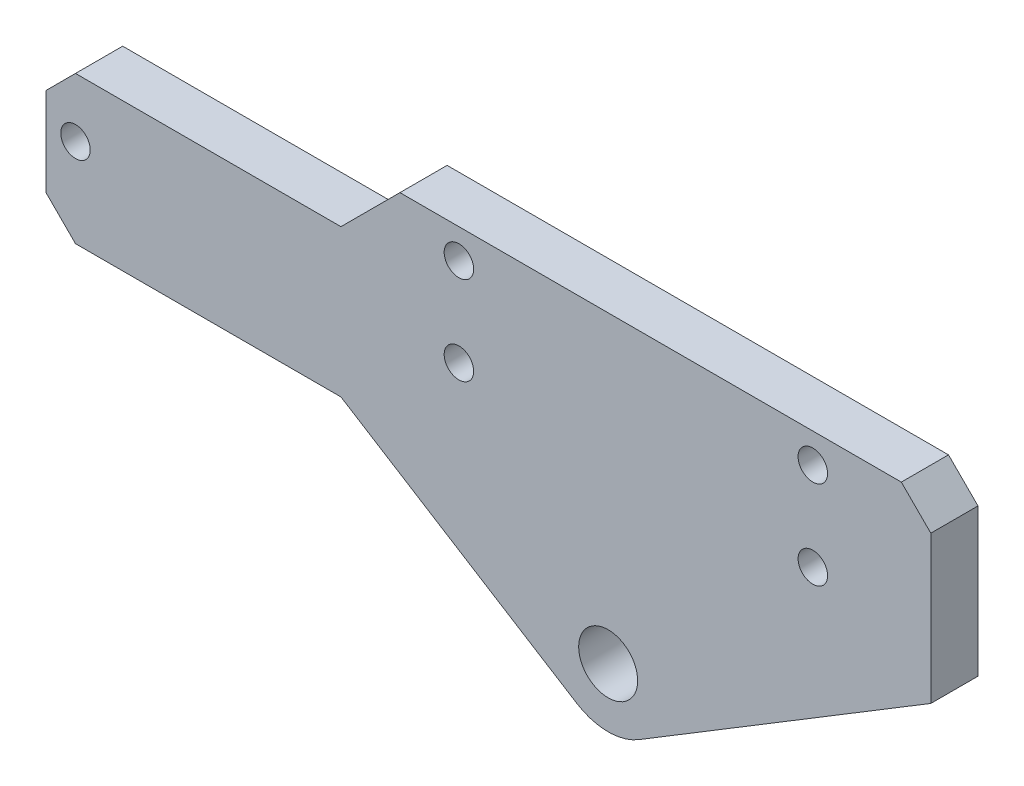
ISO-10303-21;
HEADER;
FILE_DESCRIPTION(('STEP AP214'),'2;1');
FILE_NAME('part.step','',(''),(''),'','','');
FILE_SCHEMA(('AUTOMOTIVE_DESIGN { 1 0 10303 214 1 1 1 1 }'));
ENDSEC;
DATA;
#1=APPLICATION_CONTEXT('core data for automotive mechanical design processes');
#2=APPLICATION_PROTOCOL_DEFINITION('international standard','automotive_design',2000,#1);
#3=PRODUCT_CONTEXT('',#1,'mechanical');
#4=PRODUCT('Part','Part','',(#3));
#5=PRODUCT_RELATED_PRODUCT_CATEGORY('part','',(#4));
#6=PRODUCT_DEFINITION_FORMATION('','',#4);
#7=PRODUCT_DEFINITION_CONTEXT('part definition',#1,'design');
#8=PRODUCT_DEFINITION('design','',#6,#7);
#9=PRODUCT_DEFINITION_SHAPE('','',#8);
#10=(LENGTH_UNIT() NAMED_UNIT(*) SI_UNIT(.MILLI.,.METRE.));
#11=(NAMED_UNIT(*) PLANE_ANGLE_UNIT() SI_UNIT($,.RADIAN.));
#12=(NAMED_UNIT(*) SI_UNIT($,.STERADIAN.) SOLID_ANGLE_UNIT());
#13=UNCERTAINTY_MEASURE_WITH_UNIT(LENGTH_MEASURE(1.E-05),#10,'distance_accuracy_value','');
#14=(GEOMETRIC_REPRESENTATION_CONTEXT(3) GLOBAL_UNCERTAINTY_ASSIGNED_CONTEXT((#13)) GLOBAL_UNIT_ASSIGNED_CONTEXT((#10,
#11,#12)) REPRESENTATION_CONTEXT('',''));
#15=CARTESIAN_POINT('',(0.,0.,0.));
#16=DIRECTION('',(0.,0.,1.));
#17=DIRECTION('',(1.,0.,0.));
#18=AXIS2_PLACEMENT_3D('',#15,#16,#17);
#19=CARTESIAN_POINT('',(20.7761574685095,-27.798118796545,3.5));
#20=DIRECTION('',(0.,0.,-1.));
#21=DIRECTION('',(-1.,0.,0.));
#22=AXIS2_PLACEMENT_3D('',#19,#20,#21);
#23=CYLINDRICAL_SURFACE('',#22,5.00000000000001);
#24=CARTESIAN_POINT('',(20.7761574685095,-27.798118796545,-11.5));
#25=DIRECTION('',(0.,0.,1.));
#26=DIRECTION('',(1.,0.,0.));
#27=AXIS2_PLACEMENT_3D('',#24,#25,#26);
#28=CIRCLE('',#27,5.00000000000001);
#29=CARTESIAN_POINT('',(25.7761574685095,-27.798118796545,-11.5));
#30=VERTEX_POINT('',#29);
#31=EDGE_CURVE('E197',#30,#30,#28,.T.);
#32=ORIENTED_EDGE('',*,*,#31,.F.);
#33=EDGE_LOOP('',(#32));
#34=FACE_BOUND('',#33,.T.);
#35=CARTESIAN_POINT('',(20.7761574685095,-27.798118796545,-3.5));
#36=DIRECTION('',(0.,0.,-1.));
#37=DIRECTION('',(-1.,0.,0.));
#38=AXIS2_PLACEMENT_3D('',#35,#36,#37);
#39=CIRCLE('',#38,5.00000000000001);
#40=CARTESIAN_POINT('',(15.7761574685095,-27.798118796545,-3.5));
#41=VERTEX_POINT('',#40);
#42=EDGE_CURVE('E221',#41,#41,#39,.T.);
#43=ORIENTED_EDGE('',*,*,#42,.F.);
#44=EDGE_LOOP('',(#43));
#45=FACE_BOUND('',#44,.T.);
#46=ADVANCED_FACE('F39',(#34,#45),#23,.F.);
#47=CARTESIAN_POINT('',(20.7761574685095,-27.798118796545,-11.5));
#48=DIRECTION('',(0.,0.,1.));
#49=DIRECTION('',(-1.,0.,0.));
#50=AXIS2_PLACEMENT_3D('',#47,#48,#49);
#51=CYLINDRICAL_SURFACE('',#50,10.);
#52=CARTESIAN_POINT('',(20.7761574685095,-27.798118796545,-3.5));
#53=DIRECTION('',(0.,0.,-1.));
#54=DIRECTION('',(-1.,0.,0.));
#55=AXIS2_PLACEMENT_3D('',#52,#53,#54);
#56=CIRCLE('',#55,10.);
#57=CARTESIAN_POINT('',(25.9669617763287,-36.345372778844,-3.5));
#58=VERTEX_POINT('',#57);
#59=CARTESIAN_POINT('',(15.4761680684777,-36.2781018365958,-3.5));
#60=VERTEX_POINT('',#59);
#61=EDGE_CURVE('E239',#58,#60,#56,.T.);
#62=ORIENTED_EDGE('',*,*,#61,.T.);
#63=DIRECTION('',(0.,0.,1.));
#64=VECTOR('',#63,1.);
#65=CARTESIAN_POINT('',(15.4761680684777,-36.2781018365958,-11.5));
#66=LINE('',#65,#64);
#67=CARTESIAN_POINT('',(15.4761680684777,-36.2781018365958,-11.5));
#68=VERTEX_POINT('',#67);
#69=EDGE_CURVE('E180',#68,#60,#66,.T.);
#70=ORIENTED_EDGE('',*,*,#69,.F.);
#71=CARTESIAN_POINT('',(20.7761574685095,-27.798118796545,-11.5));
#72=DIRECTION('',(0.,0.,1.));
#73=DIRECTION('',(1.,0.,0.));
#74=AXIS2_PLACEMENT_3D('',#71,#72,#73);
#75=CIRCLE('',#74,10.);
#76=CARTESIAN_POINT('',(25.9669617763287,-36.345372778844,-11.5));
#77=VERTEX_POINT('',#76);
#78=EDGE_CURVE('E194',#68,#77,#75,.T.);
#79=ORIENTED_EDGE('',*,*,#78,.T.);
#80=DIRECTION('',(0.,0.,1.));
#81=VECTOR('',#80,1.);
#82=CARTESIAN_POINT('',(25.9669617763287,-36.345372778844,-11.5));
#83=LINE('',#82,#81);
#84=EDGE_CURVE('E171',#77,#58,#83,.T.);
#85=ORIENTED_EDGE('',*,*,#84,.T.);
#86=EDGE_LOOP('',(#62,#70,#79,#85));
#87=FACE_BOUND('',#86,.T.);
#88=ADVANCED_FACE('F276',(#87),#51,.T.);
#89=CARTESIAN_POINT('',(75.4761680684777,-6.27810183659583,-11.5));
#90=DIRECTION('',(-0.519080430781914,0.854725398229901,0.));
#91=DIRECTION('',(-0.854725398229901,-0.519080430781914,0.));
#92=AXIS2_PLACEMENT_3D('',#89,#90,#91);
#93=PLANE('',#92);
#94=DIRECTION('',(-0.854725398229901,-0.519080430781914,0.));
#95=VECTOR('',#94,1.);
#96=CARTESIAN_POINT('',(75.4761680684777,-6.27810183659583,-3.5));
#97=LINE('',#96,#95);
#98=CARTESIAN_POINT('',(75.4761680684777,-6.27810183659583,-3.5));
#99=VERTEX_POINT('',#98);
#100=EDGE_CURVE('E242',#99,#58,#97,.T.);
#101=ORIENTED_EDGE('',*,*,#100,.T.);
#102=ORIENTED_EDGE('',*,*,#84,.F.);
#103=DIRECTION('',(0.854725398229901,0.519080430781914,0.));
#104=VECTOR('',#103,1.);
#105=CARTESIAN_POINT('',(75.4761680684777,-6.27810183659583,-11.5));
#106=LINE('',#105,#104);
#107=CARTESIAN_POINT('',(75.4761680684777,-6.27810183659583,-11.5));
#108=VERTEX_POINT('',#107);
#109=EDGE_CURVE('E191',#77,#108,#106,.T.);
#110=ORIENTED_EDGE('',*,*,#109,.T.);
#111=DIRECTION('',(0.,0.,1.));
#112=VECTOR('',#111,1.);
#113=CARTESIAN_POINT('',(75.4761680684777,-6.27810183659583,-11.5));
#114=LINE('',#113,#112);
#115=EDGE_CURVE('E174',#108,#99,#114,.T.);
#116=ORIENTED_EDGE('',*,*,#115,.T.);
#117=EDGE_LOOP('',(#101,#102,#110,#116));
#118=FACE_BOUND('',#117,.T.);
#119=ADVANCED_FACE('F279',(#118),#93,.F.);
#120=CARTESIAN_POINT('',(75.4761680684777,23.7218981634042,-11.5));
#121=DIRECTION('',(-1.,0.,0.));
#122=DIRECTION('',(0.,0.,-1.));
#123=AXIS2_PLACEMENT_3D('',#120,#121,#122);
#124=PLANE('',#123);
#125=DIRECTION('',(0.,-1.,0.));
#126=VECTOR('',#125,1.);
#127=CARTESIAN_POINT('',(75.4761680684777,23.7218981634042,-3.5));
#128=LINE('',#127,#126);
#129=CARTESIAN_POINT('',(75.4761680684777,18.7218981634042,-3.5));
#130=VERTEX_POINT('',#129);
#131=EDGE_CURVE('E244',#130,#99,#128,.T.);
#132=ORIENTED_EDGE('',*,*,#131,.T.);
#133=ORIENTED_EDGE('',*,*,#115,.F.);
#134=DIRECTION('',(0.,1.,0.));
#135=VECTOR('',#134,1.);
#136=CARTESIAN_POINT('',(75.4761680684777,23.7218981634042,-11.5));
#137=LINE('',#136,#135);
#138=CARTESIAN_POINT('',(75.4761680684777,18.7218981634042,-11.5));
#139=VERTEX_POINT('',#138);
#140=EDGE_CURVE('E188',#108,#139,#137,.T.);
#141=ORIENTED_EDGE('',*,*,#140,.T.);
#142=DIRECTION('',(0.,0.,-1.));
#143=VECTOR('',#142,1.);
#144=CARTESIAN_POINT('',(75.4761680684777,18.7218981634042,-11.5));
#145=LINE('',#144,#143);
#146=EDGE_CURVE('E157',#130,#139,#145,.T.);
#147=ORIENTED_EDGE('',*,*,#146,.F.);
#148=EDGE_LOOP('',(#132,#133,#141,#147));
#149=FACE_BOUND('',#148,.T.);
#150=ADVANCED_FACE('F284',(#149),#124,.F.);
#151=CARTESIAN_POINT('',(-24.5238319315223,23.7218981634042,-11.5));
#152=DIRECTION('',(0.,-1.,0.));
#153=DIRECTION('',(0.,0.,1.));
#154=AXIS2_PLACEMENT_3D('',#151,#152,#153);
#155=PLANE('',#154);
#156=DIRECTION('',(1.,0.,0.));
#157=VECTOR('',#156,1.);
#158=CARTESIAN_POINT('',(-24.5238319315223,23.7218981634042,-3.5));
#159=LINE('',#158,#157);
#160=CARTESIAN_POINT('',(-14.5238319315222,23.7218981634042,-3.5));
#161=VERTEX_POINT('',#160);
#162=CARTESIAN_POINT('',(70.4761680684777,23.7218981634042,-3.5));
#163=VERTEX_POINT('',#162);
#164=EDGE_CURVE('E255',#161,#163,#159,.T.);
#165=ORIENTED_EDGE('',*,*,#164,.T.);
#166=DIRECTION('',(0.,0.,1.));
#167=VECTOR('',#166,1.);
#168=CARTESIAN_POINT('',(70.4761680684777,23.7218981634042,-11.5));
#169=LINE('',#168,#167);
#170=CARTESIAN_POINT('',(70.4761680684777,23.7218981634042,-11.5));
#171=VERTEX_POINT('',#170);
#172=EDGE_CURVE('E160',#171,#163,#169,.T.);
#173=ORIENTED_EDGE('',*,*,#172,.F.);
#174=DIRECTION('',(-1.,0.,0.));
#175=VECTOR('',#174,1.);
#176=CARTESIAN_POINT('',(-24.5238319315223,23.7218981634042,-11.5));
#177=LINE('',#176,#175);
#178=CARTESIAN_POINT('',(-14.5238319315222,23.7218981634042,-11.5));
#179=VERTEX_POINT('',#178);
#180=EDGE_CURVE('E185',#171,#179,#177,.T.);
#181=ORIENTED_EDGE('',*,*,#180,.T.);
#182=DIRECTION('',(0.,0.,-1.));
#183=VECTOR('',#182,1.);
#184=CARTESIAN_POINT('',(-14.5238319315222,23.7218981634042,-11.5));
#185=LINE('',#184,#183);
#186=EDGE_CURVE('E166',#161,#179,#185,.T.);
#187=ORIENTED_EDGE('',*,*,#186,.F.);
#188=EDGE_LOOP('',(#165,#173,#181,#187));
#189=FACE_BOUND('',#188,.T.);
#190=ADVANCED_FACE('F291',(#189),#155,.F.);
#191=CARTESIAN_POINT('',(15.4761680684777,-36.2781018365958,-11.5));
#192=DIRECTION('',(0.52999894000318,0.847998304005088,0.));
#193=DIRECTION('',(-0.847998304005088,0.52999894000318,0.));
#194=AXIS2_PLACEMENT_3D('',#191,#192,#193);
#195=PLANE('',#194);
#196=DIRECTION('',(-0.847998304005088,0.52999894000318,0.));
#197=VECTOR('',#196,1.);
#198=CARTESIAN_POINT('',(15.4761680684777,-36.2781018365958,-3.5));
#199=LINE('',#198,#197);
#200=CARTESIAN_POINT('',(-24.5238319315223,-11.2781018365958,-3.5));
#201=VERTEX_POINT('',#200);
#202=EDGE_CURVE('E246',#60,#201,#199,.T.);
#203=ORIENTED_EDGE('',*,*,#202,.T.);
#204=DIRECTION('',(0.,0.,1.));
#205=VECTOR('',#204,1.);
#206=CARTESIAN_POINT('',(-24.5238319315223,-11.2781018365958,-11.5));
#207=LINE('',#206,#205);
#208=CARTESIAN_POINT('',(-24.5238319315223,-11.2781018365958,-11.5));
#209=VERTEX_POINT('',#208);
#210=EDGE_CURVE('E177',#209,#201,#207,.T.);
#211=ORIENTED_EDGE('',*,*,#210,.F.);
#212=DIRECTION('',(0.847998304005088,-0.52999894000318,0.));
#213=VECTOR('',#212,1.);
#214=CARTESIAN_POINT('',(15.4761680684777,-36.2781018365958,-11.5));
#215=LINE('',#214,#213);
#216=EDGE_CURVE('E183',#209,#68,#215,.T.);
#217=ORIENTED_EDGE('',*,*,#216,.T.);
#218=ORIENTED_EDGE('',*,*,#69,.T.);
#219=EDGE_LOOP('',(#203,#211,#217,#218));
#220=FACE_BOUND('',#219,.T.);
#221=ADVANCED_FACE('F273',(#220),#195,.F.);
#222=CARTESIAN_POINT('',(-4.5238319315223,18.7218981634042,-11.5));
#223=DIRECTION('',(0.,0.,1.));
#224=DIRECTION('',(-1.,0.,0.));
#225=AXIS2_PLACEMENT_3D('',#222,#223,#224);
#226=CYLINDRICAL_SURFACE('',#225,2.5);
#227=CARTESIAN_POINT('',(-4.5238319315223,18.7218981634042,-11.5));
#228=DIRECTION('',(0.,0.,1.));
#229=DIRECTION('',(1.,0.,0.));
#230=AXIS2_PLACEMENT_3D('',#227,#228,#229);
#231=CIRCLE('',#230,2.5);
#232=CARTESIAN_POINT('',(-2.0238319315223,18.7218981634042,-11.5));
#233=VERTEX_POINT('',#232);
#234=EDGE_CURVE('E200',#233,#233,#231,.T.);
#235=ORIENTED_EDGE('',*,*,#234,.F.);
#236=EDGE_LOOP('',(#235));
#237=FACE_BOUND('',#236,.T.);
#238=CARTESIAN_POINT('',(-4.5238319315223,18.7218981634042,-3.5));
#239=DIRECTION('',(0.,0.,-1.));
#240=DIRECTION('',(-1.,0.,0.));
#241=AXIS2_PLACEMENT_3D('',#238,#239,#240);
#242=CIRCLE('',#241,2.5);
#243=CARTESIAN_POINT('',(-7.0238319315223,18.7218981634042,-3.5));
#244=VERTEX_POINT('',#243);
#245=EDGE_CURVE('E224',#244,#244,#242,.T.);
#246=ORIENTED_EDGE('',*,*,#245,.F.);
#247=EDGE_LOOP('',(#246));
#248=FACE_BOUND('',#247,.T.);
#249=ADVANCED_FACE('F420',(#237,#248),#226,.F.);
#250=CARTESIAN_POINT('',(-4.52383193152229,3.72189816340415,-11.5));
#251=DIRECTION('',(0.,0.,1.));
#252=DIRECTION('',(-1.,0.,0.));
#253=AXIS2_PLACEMENT_3D('',#250,#251,#252);
#254=CYLINDRICAL_SURFACE('',#253,2.5);
#255=CARTESIAN_POINT('',(-4.52383193152229,3.72189816340415,-11.5));
#256=DIRECTION('',(0.,0.,1.));
#257=DIRECTION('',(1.,0.,0.));
#258=AXIS2_PLACEMENT_3D('',#255,#256,#257);
#259=CIRCLE('',#258,2.5);
#260=CARTESIAN_POINT('',(-2.02383193152229,3.72189816340415,-11.5));
#261=VERTEX_POINT('',#260);
#262=EDGE_CURVE('E203',#261,#261,#259,.T.);
#263=ORIENTED_EDGE('',*,*,#262,.F.);
#264=EDGE_LOOP('',(#263));
#265=FACE_BOUND('',#264,.T.);
#266=CARTESIAN_POINT('',(-4.52383193152229,3.72189816340415,-3.5));
#267=DIRECTION('',(0.,0.,-1.));
#268=DIRECTION('',(-1.,0.,0.));
#269=AXIS2_PLACEMENT_3D('',#266,#267,#268);
#270=CIRCLE('',#269,2.5);
#271=CARTESIAN_POINT('',(-7.02383193152229,3.72189816340415,-3.5));
#272=VERTEX_POINT('',#271);
#273=EDGE_CURVE('E227',#272,#272,#270,.T.);
#274=ORIENTED_EDGE('',*,*,#273,.F.);
#275=EDGE_LOOP('',(#274));
#276=FACE_BOUND('',#275,.T.);
#277=ADVANCED_FACE('F411',(#265,#276),#254,.F.);
#278=CARTESIAN_POINT('',(55.4761680684777,18.7218981634042,-11.5));
#279=DIRECTION('',(0.,0.,1.));
#280=DIRECTION('',(-1.,0.,0.));
#281=AXIS2_PLACEMENT_3D('',#278,#279,#280);
#282=CYLINDRICAL_SURFACE('',#281,2.5);
#283=CARTESIAN_POINT('',(55.4761680684777,18.7218981634042,-11.5));
#284=DIRECTION('',(0.,0.,1.));
#285=DIRECTION('',(1.,0.,0.));
#286=AXIS2_PLACEMENT_3D('',#283,#284,#285);
#287=CIRCLE('',#286,2.5);
#288=CARTESIAN_POINT('',(57.9761680684777,18.7218981634042,-11.5));
#289=VERTEX_POINT('',#288);
#290=EDGE_CURVE('E206',#289,#289,#287,.T.);
#291=ORIENTED_EDGE('',*,*,#290,.F.);
#292=EDGE_LOOP('',(#291));
#293=FACE_BOUND('',#292,.T.);
#294=CARTESIAN_POINT('',(55.4761680684777,18.7218981634042,-3.5));
#295=DIRECTION('',(0.,0.,-1.));
#296=DIRECTION('',(-1.,0.,0.));
#297=AXIS2_PLACEMENT_3D('',#294,#295,#296);
#298=CIRCLE('',#297,2.5);
#299=CARTESIAN_POINT('',(52.9761680684777,18.7218981634042,-3.5));
#300=VERTEX_POINT('',#299);
#301=EDGE_CURVE('E230',#300,#300,#298,.T.);
#302=ORIENTED_EDGE('',*,*,#301,.F.);
#303=EDGE_LOOP('',(#302));
#304=FACE_BOUND('',#303,.T.);
#305=ADVANCED_FACE('F402',(#293,#304),#282,.F.);
#306=CARTESIAN_POINT('',(55.4761680684777,3.72189816340416,-11.5));
#307=DIRECTION('',(0.,0.,1.));
#308=DIRECTION('',(-1.,0.,0.));
#309=AXIS2_PLACEMENT_3D('',#306,#307,#308);
#310=CYLINDRICAL_SURFACE('',#309,2.5);
#311=CARTESIAN_POINT('',(55.4761680684777,3.72189816340416,-11.5));
#312=DIRECTION('',(0.,0.,1.));
#313=DIRECTION('',(1.,0.,0.));
#314=AXIS2_PLACEMENT_3D('',#311,#312,#313);
#315=CIRCLE('',#314,2.5);
#316=CARTESIAN_POINT('',(57.9761680684777,3.72189816340416,-11.5));
#317=VERTEX_POINT('',#316);
#318=EDGE_CURVE('E209',#317,#317,#315,.T.);
#319=ORIENTED_EDGE('',*,*,#318,.F.);
#320=EDGE_LOOP('',(#319));
#321=FACE_BOUND('',#320,.T.);
#322=CARTESIAN_POINT('',(55.4761680684777,3.72189816340416,-3.5));
#323=DIRECTION('',(0.,0.,-1.));
#324=DIRECTION('',(-1.,0.,0.));
#325=AXIS2_PLACEMENT_3D('',#322,#323,#324);
#326=CIRCLE('',#325,2.5);
#327=CARTESIAN_POINT('',(52.9761680684777,3.72189816340416,-3.5));
#328=VERTEX_POINT('',#327);
#329=EDGE_CURVE('E233',#328,#328,#326,.T.);
#330=ORIENTED_EDGE('',*,*,#329,.F.);
#331=EDGE_LOOP('',(#330));
#332=FACE_BOUND('',#331,.T.);
#333=ADVANCED_FACE('F331',(#321,#332),#310,.F.);
#334=CARTESIAN_POINT('',(-24.5238319315223,13.7218981634042,-11.5));
#335=DIRECTION('',(0.707106781186546,-0.707106781186548,0.));
#336=DIRECTION('',(0.,0.,1.));
#337=AXIS2_PLACEMENT_3D('',#334,#335,#336);
#338=PLANE('',#337);
#339=ORIENTED_EDGE('',*,*,#186,.T.);
#340=DIRECTION('',(0.707106781186549,0.707106781186547,0.));
#341=VECTOR('',#340,1.);
#342=CARTESIAN_POINT('',(-22.6338457114809,15.6118843834456,-11.5));
#343=LINE('',#342,#341);
#344=CARTESIAN_POINT('',(-24.5238319315223,13.7218981634042,-11.5));
#345=VERTEX_POINT('',#344);
#346=EDGE_CURVE('E163',#179,#345,#343,.F.);
#347=ORIENTED_EDGE('',*,*,#346,.T.);
#348=DIRECTION('',(0.,0.,1.));
#349=VECTOR('',#348,1.);
#350=CARTESIAN_POINT('',(-24.5238319315223,13.7218981634042,-11.5));
#351=LINE('',#350,#349);
#352=CARTESIAN_POINT('',(-24.5238319315223,13.7218981634042,-3.5));
#353=VERTEX_POINT('',#352);
#354=EDGE_CURVE('E169',#345,#353,#351,.T.);
#355=ORIENTED_EDGE('',*,*,#354,.T.);
#356=DIRECTION('',(0.707106781186549,0.707106781186547,0.));
#357=VECTOR('',#356,1.);
#358=CARTESIAN_POINT('',(-24.5238319315223,13.7218981634042,-3.5));
#359=LINE('',#358,#357);
#360=EDGE_CURVE('E138',#161,#353,#359,.F.);
#361=ORIENTED_EDGE('',*,*,#360,.F.);
#362=EDGE_LOOP('',(#339,#347,#355,#361));
#363=FACE_BOUND('',#362,.T.);
#364=ADVANCED_FACE('F293',(#363),#338,.F.);
#365=CARTESIAN_POINT('',(70.4761680684777,23.7218981634042,-11.5));
#366=DIRECTION('',(-0.707106781186548,-0.707106781186546,0.));
#367=DIRECTION('',(0.,0.,1.));
#368=AXIS2_PLACEMENT_3D('',#365,#366,#367);
#369=PLANE('',#368);
#370=ORIENTED_EDGE('',*,*,#146,.T.);
#371=DIRECTION('',(0.707106781186547,-0.707106781186549,0.));
#372=VECTOR('',#371,1.);
#373=CARTESIAN_POINT('',(71.3861712484683,22.8118949834136,-11.5));
#374=LINE('',#373,#372);
#375=EDGE_CURVE('E155',#139,#171,#374,.F.);
#376=ORIENTED_EDGE('',*,*,#375,.T.);
#377=ORIENTED_EDGE('',*,*,#172,.T.);
#378=DIRECTION('',(0.707106781186547,-0.707106781186549,0.));
#379=VECTOR('',#378,1.);
#380=CARTESIAN_POINT('',(70.4761680684777,23.7218981634042,-3.5));
#381=LINE('',#380,#379);
#382=EDGE_CURVE('E249',#130,#163,#381,.F.);
#383=ORIENTED_EDGE('',*,*,#382,.F.);
#384=EDGE_LOOP('',(#370,#376,#377,#383));
#385=FACE_BOUND('',#384,.T.);
#386=ADVANCED_FACE('F286',(#385),#369,.F.);
#387=CARTESIAN_POINT('',(-24.5238319315223,13.7218981634042,54.4016994374948));
#388=DIRECTION('',(0.,1.,0.));
#389=DIRECTION('',(-1.,0.,0.));
#390=AXIS2_PLACEMENT_3D('',#387,#388,#389);
#391=PLANE('',#390);
#392=ORIENTED_EDGE('',*,*,#354,.F.);
#393=DIRECTION('',(-1.,0.,0.));
#394=VECTOR('',#393,1.);
#395=CARTESIAN_POINT('',(-24.5238319315223,13.7218981634042,-11.5));
#396=LINE('',#395,#394);
#397=CARTESIAN_POINT('',(-69.5238319315223,13.7218981634042,-11.5));
#398=VERTEX_POINT('',#397);
#399=EDGE_CURVE('E145',#345,#398,#396,.T.);
#400=ORIENTED_EDGE('',*,*,#399,.T.);
#401=DIRECTION('',(0.,0.,-1.));
#402=VECTOR('',#401,1.);
#403=CARTESIAN_POINT('',(-69.5238319315223,13.7218981634042,54.4016994374948));
#404=LINE('',#403,#402);
#405=CARTESIAN_POINT('',(-69.5238319315223,13.7218981634042,-3.5));
#406=VERTEX_POINT('',#405);
#407=EDGE_CURVE('E47',#406,#398,#404,.T.);
#408=ORIENTED_EDGE('',*,*,#407,.F.);
#409=DIRECTION('',(-1.,0.,0.));
#410=VECTOR('',#409,1.);
#411=CARTESIAN_POINT('',(-24.5238319315223,13.7218981634042,-3.5));
#412=LINE('',#411,#410);
#413=EDGE_CURVE('E133',#353,#406,#412,.T.);
#414=ORIENTED_EDGE('',*,*,#413,.F.);
#415=EDGE_LOOP('',(#392,#400,#408,#414));
#416=FACE_BOUND('',#415,.T.);
#417=ADVANCED_FACE('F144',(#416),#391,.T.);
#418=CARTESIAN_POINT('',(-74.5238319315223,13.7218981634042,54.4016994374948));
#419=DIRECTION('',(-1.,0.,0.));
#420=DIRECTION('',(0.,0.,-1.));
#421=AXIS2_PLACEMENT_3D('',#418,#419,#420);
#422=PLANE('',#421);
#423=DIRECTION('',(0.,0.,1.));
#424=VECTOR('',#423,1.);
#425=CARTESIAN_POINT('',(-74.5238319315223,8.72189816340416,54.4016994374948));
#426=LINE('',#425,#424);
#427=CARTESIAN_POINT('',(-74.5238319315223,8.72189816340416,-11.5));
#428=VERTEX_POINT('',#427);
#429=CARTESIAN_POINT('',(-74.5238319315223,8.72189816340416,-3.5));
#430=VERTEX_POINT('',#429);
#431=EDGE_CURVE('E131',#428,#430,#426,.T.);
#432=ORIENTED_EDGE('',*,*,#431,.F.);
#433=DIRECTION('',(0.,-1.,0.));
#434=VECTOR('',#433,1.);
#435=CARTESIAN_POINT('',(-74.5238319315223,13.7218981634042,-11.5));
#436=LINE('',#435,#434);
#437=CARTESIAN_POINT('',(-74.5238319315223,-6.27810183659583,-11.5));
#438=VERTEX_POINT('',#437);
#439=EDGE_CURVE('E214',#428,#438,#436,.T.);
#440=ORIENTED_EDGE('',*,*,#439,.T.);
#441=DIRECTION('',(0.,0.,-1.));
#442=VECTOR('',#441,1.);
#443=CARTESIAN_POINT('',(-74.5238319315223,-6.27810183659583,54.4016994374948));
#444=LINE('',#443,#442);
#445=CARTESIAN_POINT('',(-74.5238319315223,-6.27810183659583,-3.5));
#446=VERTEX_POINT('',#445);
#447=EDGE_CURVE('E152',#446,#438,#444,.T.);
#448=ORIENTED_EDGE('',*,*,#447,.F.);
#449=DIRECTION('',(0.,-1.,0.));
#450=VECTOR('',#449,1.);
#451=CARTESIAN_POINT('',(-74.5238319315223,13.7218981634042,-3.5));
#452=LINE('',#451,#450);
#453=EDGE_CURVE('E142',#430,#446,#452,.T.);
#454=ORIENTED_EDGE('',*,*,#453,.F.);
#455=EDGE_LOOP('',(#432,#440,#448,#454));
#456=FACE_BOUND('',#455,.T.);
#457=ADVANCED_FACE('F262',(#456),#422,.T.);
#458=CARTESIAN_POINT('',(-24.5238319315223,-11.2781018365958,54.4016994374948));
#459=DIRECTION('',(0.,-1.,0.));
#460=DIRECTION('',(1.,0.,0.));
#461=AXIS2_PLACEMENT_3D('',#458,#459,#460);
#462=PLANE('',#461);
#463=DIRECTION('',(0.,0.,1.));
#464=VECTOR('',#463,1.);
#465=CARTESIAN_POINT('',(-69.5238319315223,-11.2781018365958,54.4016994374948));
#466=LINE('',#465,#464);
#467=CARTESIAN_POINT('',(-69.5238319315223,-11.2781018365958,-11.5));
#468=VERTEX_POINT('',#467);
#469=CARTESIAN_POINT('',(-69.5238319315223,-11.2781018365958,-3.5));
#470=VERTEX_POINT('',#469);
#471=EDGE_CURVE('E146',#468,#470,#466,.T.);
#472=ORIENTED_EDGE('',*,*,#471,.F.);
#473=DIRECTION('',(1.,0.,0.));
#474=VECTOR('',#473,1.);
#475=CARTESIAN_POINT('',(-24.5238319315223,-11.2781018365958,-11.5));
#476=LINE('',#475,#474);
#477=EDGE_CURVE('E212',#468,#209,#476,.T.);
#478=ORIENTED_EDGE('',*,*,#477,.T.);
#479=ORIENTED_EDGE('',*,*,#210,.T.);
#480=DIRECTION('',(1.,0.,0.));
#481=VECTOR('',#480,1.);
#482=CARTESIAN_POINT('',(-24.5238319315223,-11.2781018365958,-3.5));
#483=LINE('',#482,#481);
#484=EDGE_CURVE('E251',#470,#201,#483,.T.);
#485=ORIENTED_EDGE('',*,*,#484,.F.);
#486=EDGE_LOOP('',(#472,#478,#479,#485));
#487=FACE_BOUND('',#486,.T.);
#488=ADVANCED_FACE('F267',(#487),#462,.T.);
#489=CARTESIAN_POINT('',(-69.5238319315223,3.72189816340415,54.4016994374948));
#490=DIRECTION('',(0.,0.,-1.));
#491=DIRECTION('',(1.,0.,0.));
#492=AXIS2_PLACEMENT_3D('',#489,#490,#491);
#493=CYLINDRICAL_SURFACE('',#492,2.50000000000001);
#494=CARTESIAN_POINT('',(-69.5238319315223,3.72189816340415,-11.5));
#495=DIRECTION('',(0.,0.,1.));
#496=DIRECTION('',(1.,0.,0.));
#497=AXIS2_PLACEMENT_3D('',#494,#495,#496);
#498=CIRCLE('',#497,2.50000000000001);
#499=CARTESIAN_POINT('',(-67.0238319315223,3.72189816340415,-11.5));
#500=VERTEX_POINT('',#499);
#501=EDGE_CURVE('E218',#500,#500,#498,.T.);
#502=ORIENTED_EDGE('',*,*,#501,.F.);
#503=EDGE_LOOP('',(#502));
#504=FACE_BOUND('',#503,.T.);
#505=CARTESIAN_POINT('',(-69.5238319315223,3.72189816340415,-3.5));
#506=DIRECTION('',(0.,0.,-1.));
#507=DIRECTION('',(-1.,0.,0.));
#508=AXIS2_PLACEMENT_3D('',#505,#506,#507);
#509=CIRCLE('',#508,2.50000000000001);
#510=CARTESIAN_POINT('',(-72.0238319315223,3.72189816340415,-3.5));
#511=VERTEX_POINT('',#510);
#512=EDGE_CURVE('E236',#511,#511,#509,.F.);
#513=ORIENTED_EDGE('',*,*,#512,.T.);
#514=EDGE_LOOP('',(#513));
#515=FACE_BOUND('',#514,.T.);
#516=ADVANCED_FACE('F308',(#504,#515),#493,.F.);
#517=CARTESIAN_POINT('',(-74.5238319315223,-6.27810183659583,54.4016994374948));
#518=DIRECTION('',(0.707106781186547,0.707106781186547,0.));
#519=DIRECTION('',(0.,0.,-1.));
#520=AXIS2_PLACEMENT_3D('',#517,#518,#519);
#521=PLANE('',#520);
#522=ORIENTED_EDGE('',*,*,#447,.T.);
#523=DIRECTION('',(-0.707106781186548,0.707106781186548,0.));
#524=VECTOR('',#523,1.);
#525=CARTESIAN_POINT('',(-16.1138287515318,-64.6881050165863,-11.5));
#526=LINE('',#525,#524);
#527=EDGE_CURVE('E60',#438,#468,#526,.F.);
#528=ORIENTED_EDGE('',*,*,#527,.T.);
#529=ORIENTED_EDGE('',*,*,#471,.T.);
#530=DIRECTION('',(-0.707106781186548,0.707106781186548,0.));
#531=VECTOR('',#530,1.);
#532=CARTESIAN_POINT('',(-74.5238319315223,-6.27810183659583,-3.5));
#533=LINE('',#532,#531);
#534=EDGE_CURVE('E253',#446,#470,#533,.F.);
#535=ORIENTED_EDGE('',*,*,#534,.F.);
#536=EDGE_LOOP('',(#522,#528,#529,#535));
#537=FACE_BOUND('',#536,.T.);
#538=ADVANCED_FACE('F264',(#537),#521,.F.);
#539=CARTESIAN_POINT('',(-69.5238319315223,13.7218981634042,54.4016994374948));
#540=DIRECTION('',(0.707106781186548,-0.707106781186546,0.));
#541=DIRECTION('',(0.,0.,-1.));
#542=AXIS2_PLACEMENT_3D('',#539,#540,#541);
#543=PLANE('',#542);
#544=ORIENTED_EDGE('',*,*,#407,.T.);
#545=DIRECTION('',(0.707106781186547,0.707106781186549,0.));
#546=VECTOR('',#545,1.);
#547=CARTESIAN_POINT('',(-45.1338457114811,38.1118843834455,-11.5));
#548=LINE('',#547,#546);
#549=EDGE_CURVE('E150',#398,#428,#548,.F.);
#550=ORIENTED_EDGE('',*,*,#549,.T.);
#551=ORIENTED_EDGE('',*,*,#431,.T.);
#552=DIRECTION('',(0.707106781186547,0.707106781186549,0.));
#553=VECTOR('',#552,1.);
#554=CARTESIAN_POINT('',(-69.5238319315223,13.7218981634042,-3.5));
#555=LINE('',#554,#553);
#556=EDGE_CURVE('E12',#406,#430,#555,.F.);
#557=ORIENTED_EDGE('',*,*,#556,.F.);
#558=EDGE_LOOP('',(#544,#550,#551,#557));
#559=FACE_BOUND('',#558,.T.);
#560=ADVANCED_FACE('F41',(#559),#543,.F.);
#561=CARTESIAN_POINT('',(20.7761574685095,-27.798118796545,-11.5));
#562=DIRECTION('',(0.,0.,-1.));
#563=DIRECTION('',(1.,0.,0.));
#564=AXIS2_PLACEMENT_3D('',#561,#562,#563);
#565=PLANE('',#564);
#566=ORIENTED_EDGE('',*,*,#290,.T.);
#567=EDGE_LOOP('',(#566));
#568=FACE_BOUND('',#567,.T.);
#569=ORIENTED_EDGE('',*,*,#234,.T.);
#570=EDGE_LOOP('',(#569));
#571=FACE_BOUND('',#570,.T.);
#572=ORIENTED_EDGE('',*,*,#439,.F.);
#573=ORIENTED_EDGE('',*,*,#549,.F.);
#574=ORIENTED_EDGE('',*,*,#399,.F.);
#575=ORIENTED_EDGE('',*,*,#346,.F.);
#576=ORIENTED_EDGE('',*,*,#180,.F.);
#577=ORIENTED_EDGE('',*,*,#375,.F.);
#578=ORIENTED_EDGE('',*,*,#140,.F.);
#579=ORIENTED_EDGE('',*,*,#109,.F.);
#580=ORIENTED_EDGE('',*,*,#78,.F.);
#581=ORIENTED_EDGE('',*,*,#216,.F.);
#582=ORIENTED_EDGE('',*,*,#477,.F.);
#583=ORIENTED_EDGE('',*,*,#527,.F.);
#584=EDGE_LOOP('',(#572,#573,#574,#575,#576,#577,#578,#579,#580,#581,#582,#583));
#585=FACE_BOUND('',#584,.T.);
#586=ORIENTED_EDGE('',*,*,#31,.T.);
#587=EDGE_LOOP('',(#586));
#588=FACE_BOUND('',#587,.T.);
#589=ORIENTED_EDGE('',*,*,#262,.T.);
#590=EDGE_LOOP('',(#589));
#591=FACE_BOUND('',#590,.T.);
#592=ORIENTED_EDGE('',*,*,#318,.T.);
#593=EDGE_LOOP('',(#592));
#594=FACE_BOUND('',#593,.T.);
#595=ORIENTED_EDGE('',*,*,#501,.T.);
#596=EDGE_LOOP('',(#595));
#597=FACE_BOUND('',#596,.T.);
#598=ADVANCED_FACE('F295',(#568,#571,#585,#588,#591,#594,#597),#565,.T.);
#599=CARTESIAN_POINT('',(0.,0.,-3.5));
#600=DIRECTION('',(0.,0.,1.));
#601=DIRECTION('',(-1.,0.,0.));
#602=AXIS2_PLACEMENT_3D('',#599,#600,#601);
#603=PLANE('',#602);
#604=ORIENTED_EDGE('',*,*,#42,.T.);
#605=EDGE_LOOP('',(#604));
#606=FACE_BOUND('',#605,.T.);
#607=ORIENTED_EDGE('',*,*,#245,.T.);
#608=EDGE_LOOP('',(#607));
#609=FACE_BOUND('',#608,.T.);
#610=ORIENTED_EDGE('',*,*,#273,.T.);
#611=EDGE_LOOP('',(#610));
#612=FACE_BOUND('',#611,.T.);
#613=ORIENTED_EDGE('',*,*,#301,.T.);
#614=EDGE_LOOP('',(#613));
#615=FACE_BOUND('',#614,.T.);
#616=ORIENTED_EDGE('',*,*,#329,.T.);
#617=EDGE_LOOP('',(#616));
#618=FACE_BOUND('',#617,.T.);
#619=ORIENTED_EDGE('',*,*,#61,.F.);
#620=ORIENTED_EDGE('',*,*,#100,.F.);
#621=ORIENTED_EDGE('',*,*,#131,.F.);
#622=ORIENTED_EDGE('',*,*,#382,.T.);
#623=ORIENTED_EDGE('',*,*,#164,.F.);
#624=ORIENTED_EDGE('',*,*,#360,.T.);
#625=ORIENTED_EDGE('',*,*,#413,.T.);
#626=ORIENTED_EDGE('',*,*,#556,.T.);
#627=ORIENTED_EDGE('',*,*,#453,.T.);
#628=ORIENTED_EDGE('',*,*,#534,.T.);
#629=ORIENTED_EDGE('',*,*,#484,.T.);
#630=ORIENTED_EDGE('',*,*,#202,.F.);
#631=EDGE_LOOP('',(#619,#620,#621,#622,#623,#624,#625,#626,#627,#628,#629,#630));
#632=FACE_BOUND('',#631,.T.);
#633=ORIENTED_EDGE('',*,*,#512,.F.);
#634=EDGE_LOOP('',(#633));
#635=FACE_BOUND('',#634,.T.);
#636=ADVANCED_FACE('F135',(#606,#609,#612,#615,#618,#632,#635),#603,.T.);
#637=CLOSED_SHELL('',(#46,#88,#119,#150,#190,#221,#249,#277,#305,#333,#364,#386,#417,#457,#488,
#516,#538,#560,#598,#636));
#638=MANIFOLD_SOLID_BREP('B2',#637);
#639=ADVANCED_BREP_SHAPE_REPRESENTATION('',(#18,#638),#14);
#640=SHAPE_DEFINITION_REPRESENTATION(#9,#639);
ENDSEC;
END-ISO-10303-21;
